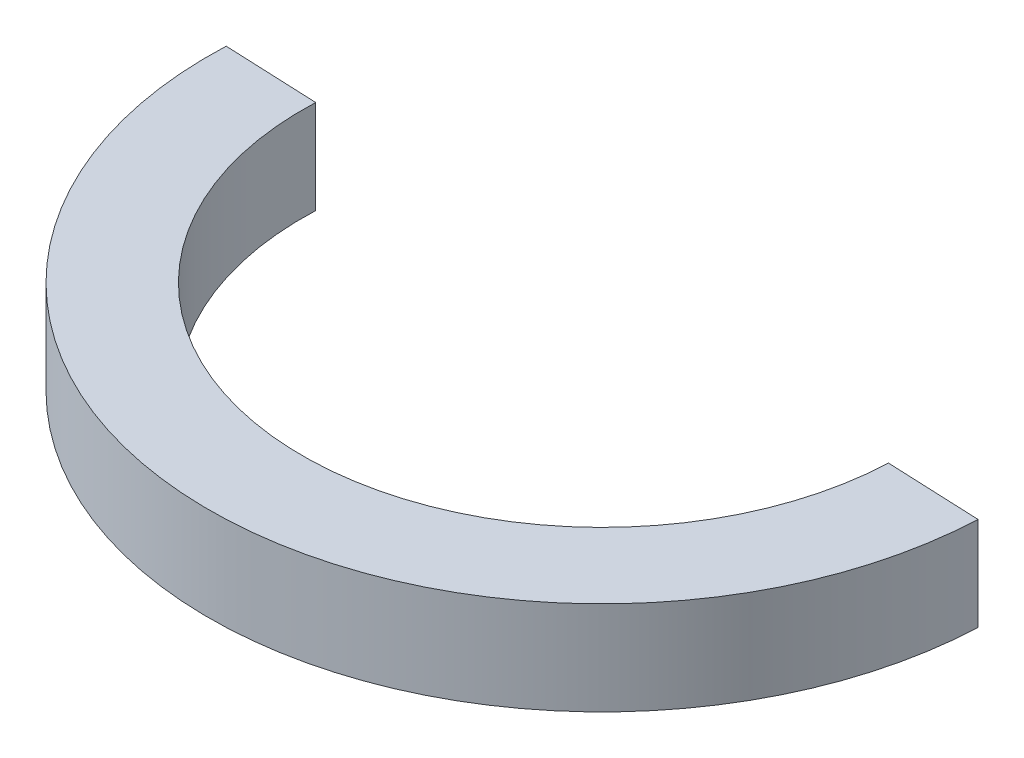
ISO-10303-21;
HEADER;
FILE_DESCRIPTION(('STEP AP214'),'2;1');
FILE_NAME('part.step','',(''),(''),'','','');
FILE_SCHEMA(('AUTOMOTIVE_DESIGN { 1 0 10303 214 1 1 1 1 }'));
ENDSEC;
DATA;
#1=APPLICATION_CONTEXT('core data for automotive mechanical design processes');
#2=APPLICATION_PROTOCOL_DEFINITION('international standard','automotive_design',2000,#1);
#3=PRODUCT_CONTEXT('',#1,'mechanical');
#4=PRODUCT('Part','Part','',(#3));
#5=PRODUCT_RELATED_PRODUCT_CATEGORY('part','',(#4));
#6=PRODUCT_DEFINITION_FORMATION('','',#4);
#7=PRODUCT_DEFINITION_CONTEXT('part definition',#1,'design');
#8=PRODUCT_DEFINITION('design','',#6,#7);
#9=PRODUCT_DEFINITION_SHAPE('','',#8);
#10=(LENGTH_UNIT() NAMED_UNIT(*) SI_UNIT(.MILLI.,.METRE.));
#11=(NAMED_UNIT(*) PLANE_ANGLE_UNIT() SI_UNIT($,.RADIAN.));
#12=(NAMED_UNIT(*) SI_UNIT($,.STERADIAN.) SOLID_ANGLE_UNIT());
#13=UNCERTAINTY_MEASURE_WITH_UNIT(LENGTH_MEASURE(1.E-05),#10,'distance_accuracy_value','');
#14=(GEOMETRIC_REPRESENTATION_CONTEXT(3) GLOBAL_UNCERTAINTY_ASSIGNED_CONTEXT((#13)) GLOBAL_UNIT_ASSIGNED_CONTEXT((#10,
#11,#12)) REPRESENTATION_CONTEXT('',''));
#15=CARTESIAN_POINT('',(0.,0.,0.));
#16=DIRECTION('',(0.,0.,1.));
#17=DIRECTION('',(1.,0.,0.));
#18=AXIS2_PLACEMENT_3D('',#15,#16,#17);
#19=CARTESIAN_POINT('',(0.,10.,0.));
#20=DIRECTION('',(0.,-1.,0.));
#21=DIRECTION('',(0.,0.,-1.));
#22=AXIS2_PLACEMENT_3D('',#19,#20,#21);
#23=CYLINDRICAL_SURFACE('',#22,42.);
#24=CARTESIAN_POINT('',(0.,0.,0.));
#25=DIRECTION('',(0.,1.,0.));
#26=DIRECTION('',(1.,0.,0.));
#27=AXIS2_PLACEMENT_3D('',#24,#25,#26);
#28=CIRCLE('',#27,42.);
#29=CARTESIAN_POINT('',(-41.96084585776,0.,-1.81312296916248));
#30=VERTEX_POINT('',#29);
#31=CARTESIAN_POINT('',(41.96084585776,0.,1.81312296916248));
#32=VERTEX_POINT('',#31);
#33=EDGE_CURVE('E111',#30,#32,#28,.T.);
#34=ORIENTED_EDGE('',*,*,#33,.T.);
#35=DIRECTION('',(0.,-1.,0.));
#36=VECTOR('',#35,1.);
#37=CARTESIAN_POINT('',(41.96084585776,10.,1.81312296916248));
#38=LINE('',#37,#36);
#39=CARTESIAN_POINT('',(41.96084585776,10.,1.81312296916248));
#40=VERTEX_POINT('',#39);
#41=EDGE_CURVE('E11',#40,#32,#38,.T.);
#42=ORIENTED_EDGE('',*,*,#41,.F.);
#43=CARTESIAN_POINT('',(0.,10.,0.));
#44=DIRECTION('',(0.,1.,0.));
#45=DIRECTION('',(1.,0.,0.));
#46=AXIS2_PLACEMENT_3D('',#43,#44,#45);
#47=CIRCLE('',#46,42.);
#48=CARTESIAN_POINT('',(-41.96084585776,10.,-1.81312296916248));
#49=VERTEX_POINT('',#48);
#50=EDGE_CURVE('E84',#49,#40,#47,.T.);
#51=ORIENTED_EDGE('',*,*,#50,.F.);
#52=DIRECTION('',(0.,-1.,0.));
#53=VECTOR('',#52,1.);
#54=CARTESIAN_POINT('',(-41.96084585776,10.,-1.81312296916248));
#55=LINE('',#54,#53);
#56=EDGE_CURVE('E60',#49,#30,#55,.T.);
#57=ORIENTED_EDGE('',*,*,#56,.T.);
#58=EDGE_LOOP('',(#34,#42,#51,#57));
#59=FACE_BOUND('',#58,.T.);
#60=ADVANCED_FACE('F43',(#59),#23,.T.);
#61=CARTESIAN_POINT('',(31.9701682725791,10.,1.38142702412379));
#62=DIRECTION('',(0.0431695945038693,0.,-0.999067758518096));
#63=DIRECTION('',(-0.999067758518096,0.,-0.0431695945038693));
#64=AXIS2_PLACEMENT_3D('',#61,#62,#63);
#65=PLANE('',#64);
#66=DIRECTION('',(0.999067758518096,0.,0.0431695945038693));
#67=VECTOR('',#66,1.);
#68=CARTESIAN_POINT('',(31.9701682725791,0.,1.38142702412379));
#69=LINE('',#68,#67);
#70=CARTESIAN_POINT('',(31.9701682725791,0.,1.38142702412379));
#71=VERTEX_POINT('',#70);
#72=EDGE_CURVE('E93',#71,#32,#69,.T.);
#73=ORIENTED_EDGE('',*,*,#72,.F.);
#74=DIRECTION('',(0.,-1.,0.));
#75=VECTOR('',#74,1.);
#76=CARTESIAN_POINT('',(31.9701682725791,10.,1.38142702412379));
#77=LINE('',#76,#75);
#78=CARTESIAN_POINT('',(31.9701682725791,10.,1.38142702412379));
#79=VERTEX_POINT('',#78);
#80=EDGE_CURVE('E52',#79,#71,#77,.T.);
#81=ORIENTED_EDGE('',*,*,#80,.F.);
#82=DIRECTION('',(0.999067758518096,0.,0.0431695945038693));
#83=VECTOR('',#82,1.);
#84=CARTESIAN_POINT('',(31.9701682725791,10.,1.38142702412379));
#85=LINE('',#84,#83);
#86=EDGE_CURVE('E91',#79,#40,#85,.T.);
#87=ORIENTED_EDGE('',*,*,#86,.T.);
#88=ORIENTED_EDGE('',*,*,#41,.T.);
#89=EDGE_LOOP('',(#73,#81,#87,#88));
#90=FACE_BOUND('',#89,.T.);
#91=ADVANCED_FACE('F90',(#90),#65,.T.);
#92=CARTESIAN_POINT('',(0.,10.,0.));
#93=DIRECTION('',(0.,-1.,0.));
#94=DIRECTION('',(0.,0.,-1.));
#95=AXIS2_PLACEMENT_3D('',#92,#93,#94);
#96=CYLINDRICAL_SURFACE('',#95,32.);
#97=CARTESIAN_POINT('',(0.,0.,0.));
#98=DIRECTION('',(0.,1.,0.));
#99=DIRECTION('',(0.,0.,1.));
#100=AXIS2_PLACEMENT_3D('',#97,#98,#99);
#101=CIRCLE('',#100,32.);
#102=CARTESIAN_POINT('',(-31.9701682725791,0.,-1.3814270241238));
#103=VERTEX_POINT('',#102);
#104=EDGE_CURVE('E116',#103,#71,#101,.T.);
#105=ORIENTED_EDGE('',*,*,#104,.F.);
#106=DIRECTION('',(0.,-1.,0.));
#107=VECTOR('',#106,1.);
#108=CARTESIAN_POINT('',(-31.9701682725791,10.,-1.3814270241238));
#109=LINE('',#108,#107);
#110=CARTESIAN_POINT('',(-31.9701682725791,10.,-1.3814270241238));
#111=VERTEX_POINT('',#110);
#112=EDGE_CURVE('E73',#111,#103,#109,.T.);
#113=ORIENTED_EDGE('',*,*,#112,.F.);
#114=CARTESIAN_POINT('',(0.,10.,0.));
#115=DIRECTION('',(0.,1.,0.));
#116=DIRECTION('',(0.,0.,1.));
#117=AXIS2_PLACEMENT_3D('',#114,#115,#116);
#118=CIRCLE('',#117,32.);
#119=EDGE_CURVE('E100',#111,#79,#118,.T.);
#120=ORIENTED_EDGE('',*,*,#119,.T.);
#121=ORIENTED_EDGE('',*,*,#80,.T.);
#122=EDGE_LOOP('',(#105,#113,#120,#121));
#123=FACE_BOUND('',#122,.T.);
#124=ADVANCED_FACE('F103',(#123),#96,.F.);
#125=CARTESIAN_POINT('',(-41.96084585776,10.,-1.81312296916248));
#126=DIRECTION('',(0.0431695945038684,0.,-0.999067758518096));
#127=DIRECTION('',(-0.999067758518096,0.,-0.0431695945038684));
#128=AXIS2_PLACEMENT_3D('',#125,#126,#127);
#129=PLANE('',#128);
#130=DIRECTION('',(0.999067758518096,0.,0.0431695945038684));
#131=VECTOR('',#130,1.);
#132=CARTESIAN_POINT('',(-41.96084585776,0.,-1.81312296916248));
#133=LINE('',#132,#131);
#134=EDGE_CURVE('E119',#30,#103,#133,.T.);
#135=ORIENTED_EDGE('',*,*,#134,.F.);
#136=ORIENTED_EDGE('',*,*,#56,.F.);
#137=DIRECTION('',(0.999067758518096,0.,0.0431695945038684));
#138=VECTOR('',#137,1.);
#139=CARTESIAN_POINT('',(-41.96084585776,10.,-1.81312296916248));
#140=LINE('',#139,#138);
#141=EDGE_CURVE('E105',#49,#111,#140,.T.);
#142=ORIENTED_EDGE('',*,*,#141,.T.);
#143=ORIENTED_EDGE('',*,*,#112,.T.);
#144=EDGE_LOOP('',(#135,#136,#142,#143));
#145=FACE_BOUND('',#144,.T.);
#146=ADVANCED_FACE('F129',(#145),#129,.T.);
#147=CARTESIAN_POINT('',(0.,10.,0.));
#148=DIRECTION('',(0.,1.,0.));
#149=DIRECTION('',(1.,0.,0.));
#150=AXIS2_PLACEMENT_3D('',#147,#148,#149);
#151=PLANE('',#150);
#152=ORIENTED_EDGE('',*,*,#50,.T.);
#153=ORIENTED_EDGE('',*,*,#86,.F.);
#154=ORIENTED_EDGE('',*,*,#119,.F.);
#155=ORIENTED_EDGE('',*,*,#141,.F.);
#156=EDGE_LOOP('',(#152,#153,#154,#155));
#157=FACE_BOUND('',#156,.T.);
#158=ADVANCED_FACE('F99',(#157),#151,.T.);
#159=CARTESIAN_POINT('',(0.,0.,0.));
#160=DIRECTION('',(0.,1.,0.));
#161=DIRECTION('',(1.,0.,0.));
#162=AXIS2_PLACEMENT_3D('',#159,#160,#161);
#163=PLANE('',#162);
#164=ORIENTED_EDGE('',*,*,#33,.F.);
#165=ORIENTED_EDGE('',*,*,#134,.T.);
#166=ORIENTED_EDGE('',*,*,#104,.T.);
#167=ORIENTED_EDGE('',*,*,#72,.T.);
#168=EDGE_LOOP('',(#164,#165,#166,#167));
#169=FACE_BOUND('',#168,.T.);
#170=ADVANCED_FACE('F128',(#169),#163,.F.);
#171=CLOSED_SHELL('',(#60,#91,#124,#146,#158,#170));
#172=MANIFOLD_SOLID_BREP('B2',#171);
#173=ADVANCED_BREP_SHAPE_REPRESENTATION('',(#18,#172),#14);
#174=SHAPE_DEFINITION_REPRESENTATION(#9,#173);
ENDSEC;
END-ISO-10303-21;
